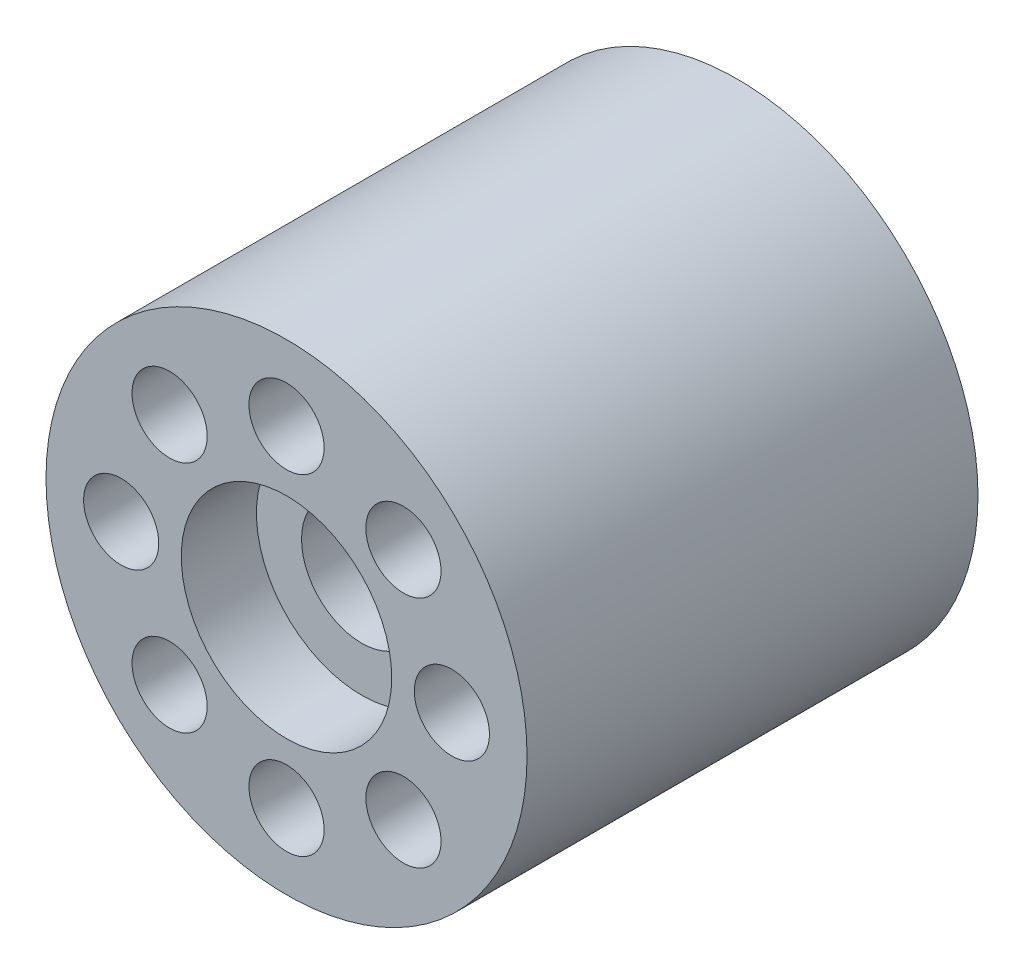
ISO-10303-21;
HEADER;
FILE_DESCRIPTION(('STEP AP214'),'2;1');
FILE_NAME('part.step','',(''),(''),'','','');
FILE_SCHEMA(('AUTOMOTIVE_DESIGN { 1 0 10303 214 1 1 1 1 }'));
ENDSEC;
DATA;
#1=APPLICATION_CONTEXT('core data for automotive mechanical design processes');
#2=APPLICATION_PROTOCOL_DEFINITION('international standard','automotive_design',2000,#1);
#3=PRODUCT_CONTEXT('',#1,'mechanical');
#4=PRODUCT('Part','Part','',(#3));
#5=PRODUCT_RELATED_PRODUCT_CATEGORY('part','',(#4));
#6=PRODUCT_DEFINITION_FORMATION('','',#4);
#7=PRODUCT_DEFINITION_CONTEXT('part definition',#1,'design');
#8=PRODUCT_DEFINITION('design','',#6,#7);
#9=PRODUCT_DEFINITION_SHAPE('','',#8);
#10=(LENGTH_UNIT() NAMED_UNIT(*) SI_UNIT(.MILLI.,.METRE.));
#11=(NAMED_UNIT(*) PLANE_ANGLE_UNIT() SI_UNIT($,.RADIAN.));
#12=(NAMED_UNIT(*) SI_UNIT($,.STERADIAN.) SOLID_ANGLE_UNIT());
#13=UNCERTAINTY_MEASURE_WITH_UNIT(LENGTH_MEASURE(1.E-05),#10,'distance_accuracy_value','');
#14=(GEOMETRIC_REPRESENTATION_CONTEXT(3) GLOBAL_UNCERTAINTY_ASSIGNED_CONTEXT((#13)) GLOBAL_UNIT_ASSIGNED_CONTEXT((#10,
#11,#12)) REPRESENTATION_CONTEXT('',''));
#15=CARTESIAN_POINT('',(0.,0.,0.));
#16=DIRECTION('',(0.,0.,1.));
#17=DIRECTION('',(1.,0.,0.));
#18=AXIS2_PLACEMENT_3D('',#15,#16,#17);
#19=CARTESIAN_POINT('',(0.,0.,0.));
#20=DIRECTION('',(0.,0.,1.));
#21=DIRECTION('',(1.,0.,0.));
#22=AXIS2_PLACEMENT_3D('',#19,#20,#21);
#23=PLANE('',#22);
#24=CARTESIAN_POINT('',(0.,0.,0.));
#25=DIRECTION('',(0.,0.,-1.));
#26=DIRECTION('',(-1.,0.,0.));
#27=AXIS2_PLACEMENT_3D('',#24,#25,#26);
#28=CIRCLE('',#27,6.);
#29=CARTESIAN_POINT('',(-6.,0.,0.));
#30=VERTEX_POINT('',#29);
#31=EDGE_CURVE('E159',#30,#30,#28,.T.);
#32=ORIENTED_EDGE('',*,*,#31,.F.);
#33=EDGE_LOOP('',(#32));
#34=FACE_BOUND('',#33,.T.);
#35=CARTESIAN_POINT('',(0.,0.,0.));
#36=DIRECTION('',(0.,0.,1.));
#37=DIRECTION('',(1.,0.,0.));
#38=AXIS2_PLACEMENT_3D('',#35,#36,#37);
#39=CIRCLE('',#38,13.5);
#40=CARTESIAN_POINT('',(13.5,1.41404994223147E-13,0.));
#41=VERTEX_POINT('',#40);
#42=CARTESIAN_POINT('',(9.54594154601828,9.54594154601851,0.));
#43=VERTEX_POINT('',#42);
#44=EDGE_CURVE('E179',#41,#43,#39,.T.);
#45=ORIENTED_EDGE('',*,*,#44,.F.);
#46=CARTESIAN_POINT('',(11.,1.15218884181823E-13,0.));
#47=DIRECTION('',(0.,0.,1.));
#48=DIRECTION('',(0.,-1.,0.));
#49=AXIS2_PLACEMENT_3D('',#46,#47,#48);
#50=CIRCLE('',#49,2.5);
#51=EDGE_CURVE('E82',#41,#41,#50,.T.);
#52=ORIENTED_EDGE('',*,*,#51,.T.);
#53=CARTESIAN_POINT('',(9.54594154601848,-9.54594154601831,0.));
#54=VERTEX_POINT('',#53);
#55=EDGE_CURVE('E183',#54,#41,#39,.T.);
#56=ORIENTED_EDGE('',*,*,#55,.F.);
#57=CARTESIAN_POINT('',(7.77817459305209,-7.77817459305195,0.));
#58=DIRECTION('',(0.,0.,1.));
#59=DIRECTION('',(-0.707106781186541,-0.707106781186554,0.));
#60=AXIS2_PLACEMENT_3D('',#57,#58,#59);
#61=CIRCLE('',#60,2.5);
#62=EDGE_CURVE('E86',#54,#54,#61,.T.);
#63=ORIENTED_EDGE('',*,*,#62,.T.);
#64=CARTESIAN_POINT('',(0.,-13.5,0.));
#65=VERTEX_POINT('',#64);
#66=EDGE_CURVE('E189',#65,#54,#39,.T.);
#67=ORIENTED_EDGE('',*,*,#66,.F.);
#68=CARTESIAN_POINT('',(0.,-11.,0.));
#69=DIRECTION('',(0.,0.,1.));
#70=DIRECTION('',(-1.,0.,0.));
#71=AXIS2_PLACEMENT_3D('',#68,#69,#70);
#72=CIRCLE('',#71,2.5);
#73=EDGE_CURVE('E92',#65,#65,#72,.T.);
#74=ORIENTED_EDGE('',*,*,#73,.T.);
#75=CARTESIAN_POINT('',(-9.54594154601834,-9.54594154601844,0.));
#76=VERTEX_POINT('',#75);
#77=EDGE_CURVE('E192',#76,#65,#39,.T.);
#78=ORIENTED_EDGE('',*,*,#77,.F.);
#79=CARTESIAN_POINT('',(-7.77817459305198,-7.77817459305206,0.));
#80=DIRECTION('',(0.,0.,1.));
#81=DIRECTION('',(-0.707106781186551,0.707106781186544,0.));
#82=AXIS2_PLACEMENT_3D('',#79,#80,#81);
#83=CIRCLE('',#82,2.5);
#84=EDGE_CURVE('E105',#76,#76,#83,.T.);
#85=ORIENTED_EDGE('',*,*,#84,.T.);
#86=CARTESIAN_POINT('',(-13.5,0.,0.));
#87=VERTEX_POINT('',#86);
#88=EDGE_CURVE('E195',#87,#76,#39,.T.);
#89=ORIENTED_EDGE('',*,*,#88,.F.);
#90=CARTESIAN_POINT('',(-11.,0.,0.));
#91=DIRECTION('',(0.,0.,1.));
#92=DIRECTION('',(0.,1.,0.));
#93=AXIS2_PLACEMENT_3D('',#90,#91,#92);
#94=CIRCLE('',#93,2.5);
#95=EDGE_CURVE('E101',#87,#87,#94,.T.);
#96=ORIENTED_EDGE('',*,*,#95,.T.);
#97=CARTESIAN_POINT('',(-9.54594154601841,9.54594154601837,0.));
#98=VERTEX_POINT('',#97);
#99=EDGE_CURVE('E62',#98,#87,#39,.T.);
#100=ORIENTED_EDGE('',*,*,#99,.F.);
#101=CARTESIAN_POINT('',(-7.77817459305204,7.77817459305201,0.));
#102=DIRECTION('',(0.,0.,1.));
#103=DIRECTION('',(0.707106781186546,0.707106781186549,0.));
#104=AXIS2_PLACEMENT_3D('',#101,#102,#103);
#105=CIRCLE('',#104,2.5);
#106=EDGE_CURVE('E104',#98,#98,#105,.T.);
#107=ORIENTED_EDGE('',*,*,#106,.T.);
#108=CARTESIAN_POINT('',(0.,13.5,0.));
#109=VERTEX_POINT('',#108);
#110=EDGE_CURVE('E57',#109,#98,#39,.T.);
#111=ORIENTED_EDGE('',*,*,#110,.F.);
#112=CARTESIAN_POINT('',(0.,11.,0.));
#113=DIRECTION('',(0.,0.,1.));
#114=DIRECTION('',(1.,0.,0.));
#115=AXIS2_PLACEMENT_3D('',#112,#113,#114);
#116=CIRCLE('',#115,2.5);
#117=EDGE_CURVE('E142',#109,#109,#116,.T.);
#118=ORIENTED_EDGE('',*,*,#117,.T.);
#119=EDGE_CURVE('E182',#43,#109,#39,.T.);
#120=ORIENTED_EDGE('',*,*,#119,.F.);
#121=CARTESIAN_POINT('',(7.77817459305193,7.77817459305212,0.));
#122=DIRECTION('',(0.,0.,1.));
#123=DIRECTION('',(0.707106781186556,-0.707106781186539,0.));
#124=AXIS2_PLACEMENT_3D('',#121,#122,#123);
#125=CIRCLE('',#124,2.5);
#126=EDGE_CURVE('E87',#43,#43,#125,.T.);
#127=ORIENTED_EDGE('',*,*,#126,.T.);
#128=EDGE_LOOP('',(#45,#52,#56,#63,#67,#74,#78,#85,#89,#96,#100,#107,#111,#118,#120,#127));
#129=FACE_BOUND('',#128,.T.);
#130=ADVANCED_FACE('F39',(#34,#129),#23,.F.);
#131=CARTESIAN_POINT('',(0.,0.,10.));
#132=DIRECTION('',(0.,0.,-1.));
#133=DIRECTION('',(-1.,0.,0.));
#134=AXIS2_PLACEMENT_3D('',#131,#132,#133);
#135=CYLINDRICAL_SURFACE('',#134,4.);
#136=CARTESIAN_POINT('',(0.,0.,5.));
#137=DIRECTION('',(0.,0.,1.));
#138=DIRECTION('',(1.,0.,0.));
#139=AXIS2_PLACEMENT_3D('',#136,#137,#138);
#140=CIRCLE('',#139,4.);
#141=CARTESIAN_POINT('',(4.,0.,5.));
#142=VERTEX_POINT('',#141);
#143=EDGE_CURVE('E95',#142,#142,#140,.T.);
#144=ORIENTED_EDGE('',*,*,#143,.T.);
#145=EDGE_LOOP('',(#144));
#146=FACE_BOUND('',#145,.T.);
#147=CARTESIAN_POINT('',(0.,0.,0.999999999999999));
#148=DIRECTION('',(0.,0.,-1.));
#149=DIRECTION('',(-1.,0.,0.));
#150=AXIS2_PLACEMENT_3D('',#147,#148,#149);
#151=CIRCLE('',#150,4.);
#152=CARTESIAN_POINT('',(-4.,0.,0.999999999999999));
#153=VERTEX_POINT('',#152);
#154=EDGE_CURVE('E43',#153,#153,#151,.T.);
#155=ORIENTED_EDGE('',*,*,#154,.T.);
#156=EDGE_LOOP('',(#155));
#157=FACE_BOUND('',#156,.T.);
#158=ADVANCED_FACE('F221',(#146,#157),#135,.F.);
#159=CARTESIAN_POINT('',(0.,0.,10.));
#160=DIRECTION('',(0.,0.,1.));
#161=DIRECTION('',(1.,0.,0.));
#162=AXIS2_PLACEMENT_3D('',#159,#160,#161);
#163=PLANE('',#162);
#164=CARTESIAN_POINT('',(0.,0.,10.));
#165=DIRECTION('',(0.,0.,1.));
#166=DIRECTION('',(1.,0.,0.));
#167=AXIS2_PLACEMENT_3D('',#164,#165,#166);
#168=CIRCLE('',#167,7.);
#169=CARTESIAN_POINT('',(7.,0.,10.));
#170=VERTEX_POINT('',#169);
#171=EDGE_CURVE('E98',#170,#170,#168,.T.);
#172=ORIENTED_EDGE('',*,*,#171,.F.);
#173=EDGE_LOOP('',(#172));
#174=FACE_BOUND('',#173,.T.);
#175=CARTESIAN_POINT('',(-11.,0.,10.));
#176=DIRECTION('',(0.,0.,1.));
#177=DIRECTION('',(1.,0.,0.));
#178=AXIS2_PLACEMENT_3D('',#175,#176,#177);
#179=CIRCLE('',#178,2.5);
#180=CARTESIAN_POINT('',(-8.5,0.,10.));
#181=VERTEX_POINT('',#180);
#182=EDGE_CURVE('E138',#181,#181,#179,.F.);
#183=ORIENTED_EDGE('',*,*,#182,.T.);
#184=EDGE_LOOP('',(#183));
#185=FACE_BOUND('',#184,.T.);
#186=CARTESIAN_POINT('',(-7.77817459305198,-7.77817459305206,10.));
#187=DIRECTION('',(0.,0.,1.));
#188=DIRECTION('',(1.,0.,0.));
#189=AXIS2_PLACEMENT_3D('',#186,#187,#188);
#190=CIRCLE('',#189,2.5);
#191=CARTESIAN_POINT('',(-5.27817459305198,-7.77817459305206,10.));
#192=VERTEX_POINT('',#191);
#193=EDGE_CURVE('E134',#192,#192,#190,.F.);
#194=ORIENTED_EDGE('',*,*,#193,.T.);
#195=EDGE_LOOP('',(#194));
#196=FACE_BOUND('',#195,.T.);
#197=CARTESIAN_POINT('',(0.,-11.,10.));
#198=DIRECTION('',(0.,0.,1.));
#199=DIRECTION('',(1.,0.,0.));
#200=AXIS2_PLACEMENT_3D('',#197,#198,#199);
#201=CIRCLE('',#200,2.5);
#202=CARTESIAN_POINT('',(2.5,-11.,10.));
#203=VERTEX_POINT('',#202);
#204=EDGE_CURVE('E130',#203,#203,#201,.F.);
#205=ORIENTED_EDGE('',*,*,#204,.T.);
#206=EDGE_LOOP('',(#205));
#207=FACE_BOUND('',#206,.T.);
#208=CARTESIAN_POINT('',(7.77817459305209,-7.77817459305195,10.));
#209=DIRECTION('',(0.,0.,1.));
#210=DIRECTION('',(1.,0.,0.));
#211=AXIS2_PLACEMENT_3D('',#208,#209,#210);
#212=CIRCLE('',#211,2.5);
#213=CARTESIAN_POINT('',(10.2781745930521,-7.77817459305195,10.));
#214=VERTEX_POINT('',#213);
#215=EDGE_CURVE('E126',#214,#214,#212,.F.);
#216=ORIENTED_EDGE('',*,*,#215,.T.);
#217=EDGE_LOOP('',(#216));
#218=FACE_BOUND('',#217,.T.);
#219=CARTESIAN_POINT('',(11.,1.15218884181823E-13,10.));
#220=DIRECTION('',(0.,0.,1.));
#221=DIRECTION('',(1.,0.,0.));
#222=AXIS2_PLACEMENT_3D('',#219,#220,#221);
#223=CIRCLE('',#222,2.5);
#224=CARTESIAN_POINT('',(13.5,1.15218884181823E-13,10.));
#225=VERTEX_POINT('',#224);
#226=EDGE_CURVE('E122',#225,#225,#223,.F.);
#227=ORIENTED_EDGE('',*,*,#226,.T.);
#228=EDGE_LOOP('',(#227));
#229=FACE_BOUND('',#228,.T.);
#230=CARTESIAN_POINT('',(7.77817459305193,7.77817459305212,10.));
#231=DIRECTION('',(0.,0.,1.));
#232=DIRECTION('',(1.,0.,0.));
#233=AXIS2_PLACEMENT_3D('',#230,#231,#232);
#234=CIRCLE('',#233,2.5);
#235=CARTESIAN_POINT('',(10.2781745930519,7.77817459305212,10.));
#236=VERTEX_POINT('',#235);
#237=EDGE_CURVE('E118',#236,#236,#234,.F.);
#238=ORIENTED_EDGE('',*,*,#237,.T.);
#239=EDGE_LOOP('',(#238));
#240=FACE_BOUND('',#239,.T.);
#241=CARTESIAN_POINT('',(-7.77817459305204,7.77817459305201,10.));
#242=DIRECTION('',(0.,0.,1.));
#243=DIRECTION('',(1.,0.,0.));
#244=AXIS2_PLACEMENT_3D('',#241,#242,#243);
#245=CIRCLE('',#244,2.5);
#246=CARTESIAN_POINT('',(-5.27817459305203,7.77817459305201,10.));
#247=VERTEX_POINT('',#246);
#248=EDGE_CURVE('E114',#247,#247,#245,.F.);
#249=ORIENTED_EDGE('',*,*,#248,.T.);
#250=EDGE_LOOP('',(#249));
#251=FACE_BOUND('',#250,.T.);
#252=CARTESIAN_POINT('',(0.,11.,10.));
#253=DIRECTION('',(0.,0.,1.));
#254=DIRECTION('',(1.,0.,0.));
#255=AXIS2_PLACEMENT_3D('',#252,#253,#254);
#256=CIRCLE('',#255,2.5);
#257=CARTESIAN_POINT('',(2.5,11.,10.));
#258=VERTEX_POINT('',#257);
#259=EDGE_CURVE('E49',#258,#258,#256,.F.);
#260=ORIENTED_EDGE('',*,*,#259,.T.);
#261=EDGE_LOOP('',(#260));
#262=FACE_BOUND('',#261,.T.);
#263=CARTESIAN_POINT('',(0.,0.,10.));
#264=DIRECTION('',(0.,0.,1.));
#265=DIRECTION('',(1.,0.,0.));
#266=AXIS2_PLACEMENT_3D('',#263,#264,#265);
#267=CIRCLE('',#266,16.);
#268=CARTESIAN_POINT('',(16.,0.,10.));
#269=VERTEX_POINT('',#268);
#270=EDGE_CURVE('E11',#269,#269,#267,.T.);
#271=ORIENTED_EDGE('',*,*,#270,.T.);
#272=EDGE_LOOP('',(#271));
#273=FACE_BOUND('',#272,.T.);
#274=ADVANCED_FACE('F216',(#174,#185,#196,#207,#218,#229,#240,#251,#262,#273),#163,.T.);
#275=CARTESIAN_POINT('',(0.,0.,10.));
#276=DIRECTION('',(0.,0.,-1.));
#277=DIRECTION('',(-1.,0.,0.));
#278=AXIS2_PLACEMENT_3D('',#275,#276,#277);
#279=CYLINDRICAL_SURFACE('',#278,16.);
#280=ORIENTED_EDGE('',*,*,#270,.F.);
#281=EDGE_LOOP('',(#280));
#282=FACE_BOUND('',#281,.T.);
#283=CARTESIAN_POINT('',(0.,0.,-20.));
#284=DIRECTION('',(0.,0.,-1.));
#285=DIRECTION('',(-1.,0.,0.));
#286=AXIS2_PLACEMENT_3D('',#283,#284,#285);
#287=CIRCLE('',#286,16.);
#288=CARTESIAN_POINT('',(-16.,0.,-20.));
#289=VERTEX_POINT('',#288);
#290=EDGE_CURVE('E164',#289,#289,#287,.T.);
#291=ORIENTED_EDGE('',*,*,#290,.F.);
#292=EDGE_LOOP('',(#291));
#293=FACE_BOUND('',#292,.T.);
#294=ADVANCED_FACE('F41',(#282,#293),#279,.T.);
#295=CARTESIAN_POINT('',(0.,11.,20.));
#296=DIRECTION('',(0.,0.,-1.));
#297=DIRECTION('',(-1.,0.,0.));
#298=AXIS2_PLACEMENT_3D('',#295,#296,#297);
#299=CYLINDRICAL_SURFACE('',#298,2.5);
#300=ORIENTED_EDGE('',*,*,#259,.F.);
#301=EDGE_LOOP('',(#300));
#302=FACE_BOUND('',#301,.T.);
#303=ORIENTED_EDGE('',*,*,#117,.F.);
#304=EDGE_LOOP('',(#303));
#305=FACE_BOUND('',#304,.T.);
#306=ADVANCED_FACE('F204',(#302,#305),#299,.F.);
#307=CARTESIAN_POINT('',(-7.77817459305204,7.77817459305201,20.));
#308=DIRECTION('',(0.,0.,-1.));
#309=DIRECTION('',(-1.,0.,0.));
#310=AXIS2_PLACEMENT_3D('',#307,#308,#309);
#311=CYLINDRICAL_SURFACE('',#310,2.5);
#312=ORIENTED_EDGE('',*,*,#248,.F.);
#313=EDGE_LOOP('',(#312));
#314=FACE_BOUND('',#313,.T.);
#315=ORIENTED_EDGE('',*,*,#106,.F.);
#316=EDGE_LOOP('',(#315));
#317=FACE_BOUND('',#316,.T.);
#318=ADVANCED_FACE('F206',(#314,#317),#311,.F.);
#319=CARTESIAN_POINT('',(7.77817459305193,7.77817459305212,20.));
#320=DIRECTION('',(0.,0.,-1.));
#321=DIRECTION('',(-1.,0.,0.));
#322=AXIS2_PLACEMENT_3D('',#319,#320,#321);
#323=CYLINDRICAL_SURFACE('',#322,2.5);
#324=ORIENTED_EDGE('',*,*,#237,.F.);
#325=EDGE_LOOP('',(#324));
#326=FACE_BOUND('',#325,.T.);
#327=ORIENTED_EDGE('',*,*,#126,.F.);
#328=EDGE_LOOP('',(#327));
#329=FACE_BOUND('',#328,.T.);
#330=ADVANCED_FACE('F213',(#326,#329),#323,.F.);
#331=CARTESIAN_POINT('',(11.,1.15218884181823E-13,20.));
#332=DIRECTION('',(0.,0.,-1.));
#333=DIRECTION('',(-1.,0.,0.));
#334=AXIS2_PLACEMENT_3D('',#331,#332,#333);
#335=CYLINDRICAL_SURFACE('',#334,2.5);
#336=ORIENTED_EDGE('',*,*,#226,.F.);
#337=EDGE_LOOP('',(#336));
#338=FACE_BOUND('',#337,.T.);
#339=ORIENTED_EDGE('',*,*,#51,.F.);
#340=EDGE_LOOP('',(#339));
#341=FACE_BOUND('',#340,.T.);
#342=ADVANCED_FACE('F83',(#338,#341),#335,.F.);
#343=CARTESIAN_POINT('',(7.77817459305209,-7.77817459305195,20.));
#344=DIRECTION('',(0.,0.,-1.));
#345=DIRECTION('',(-1.,0.,0.));
#346=AXIS2_PLACEMENT_3D('',#343,#344,#345);
#347=CYLINDRICAL_SURFACE('',#346,2.5);
#348=ORIENTED_EDGE('',*,*,#215,.F.);
#349=EDGE_LOOP('',(#348));
#350=FACE_BOUND('',#349,.T.);
#351=ORIENTED_EDGE('',*,*,#62,.F.);
#352=EDGE_LOOP('',(#351));
#353=FACE_BOUND('',#352,.T.);
#354=ADVANCED_FACE('F289',(#350,#353),#347,.F.);
#355=CARTESIAN_POINT('',(0.,-11.,20.));
#356=DIRECTION('',(0.,0.,-1.));
#357=DIRECTION('',(-1.,0.,0.));
#358=AXIS2_PLACEMENT_3D('',#355,#356,#357);
#359=CYLINDRICAL_SURFACE('',#358,2.5);
#360=ORIENTED_EDGE('',*,*,#204,.F.);
#361=EDGE_LOOP('',(#360));
#362=FACE_BOUND('',#361,.T.);
#363=ORIENTED_EDGE('',*,*,#73,.F.);
#364=EDGE_LOOP('',(#363));
#365=FACE_BOUND('',#364,.T.);
#366=ADVANCED_FACE('F300',(#362,#365),#359,.F.);
#367=CARTESIAN_POINT('',(-7.77817459305198,-7.77817459305206,20.));
#368=DIRECTION('',(0.,0.,-1.));
#369=DIRECTION('',(-1.,0.,0.));
#370=AXIS2_PLACEMENT_3D('',#367,#368,#369);
#371=CYLINDRICAL_SURFACE('',#370,2.5);
#372=ORIENTED_EDGE('',*,*,#193,.F.);
#373=EDGE_LOOP('',(#372));
#374=FACE_BOUND('',#373,.T.);
#375=ORIENTED_EDGE('',*,*,#84,.F.);
#376=EDGE_LOOP('',(#375));
#377=FACE_BOUND('',#376,.T.);
#378=ADVANCED_FACE('F296',(#374,#377),#371,.F.);
#379=CARTESIAN_POINT('',(-11.,0.,20.));
#380=DIRECTION('',(0.,0.,-1.));
#381=DIRECTION('',(-1.,0.,0.));
#382=AXIS2_PLACEMENT_3D('',#379,#380,#381);
#383=CYLINDRICAL_SURFACE('',#382,2.5);
#384=ORIENTED_EDGE('',*,*,#182,.F.);
#385=EDGE_LOOP('',(#384));
#386=FACE_BOUND('',#385,.T.);
#387=ORIENTED_EDGE('',*,*,#95,.F.);
#388=EDGE_LOOP('',(#387));
#389=FACE_BOUND('',#388,.T.);
#390=ADVANCED_FACE('F285',(#386,#389),#383,.F.);
#391=CARTESIAN_POINT('',(0.,0.,5.));
#392=DIRECTION('',(0.,0.,1.));
#393=DIRECTION('',(1.,0.,0.));
#394=AXIS2_PLACEMENT_3D('',#391,#392,#393);
#395=CYLINDRICAL_SURFACE('',#394,7.);
#396=CARTESIAN_POINT('',(0.,0.,5.));
#397=DIRECTION('',(0.,0.,1.));
#398=DIRECTION('',(1.,0.,0.));
#399=AXIS2_PLACEMENT_3D('',#396,#397,#398);
#400=CIRCLE('',#399,7.);
#401=CARTESIAN_POINT('',(7.,0.,5.));
#402=VERTEX_POINT('',#401);
#403=EDGE_CURVE('E149',#402,#402,#400,.T.);
#404=ORIENTED_EDGE('',*,*,#403,.F.);
#405=EDGE_LOOP('',(#404));
#406=FACE_BOUND('',#405,.T.);
#407=ORIENTED_EDGE('',*,*,#171,.T.);
#408=EDGE_LOOP('',(#407));
#409=FACE_BOUND('',#408,.T.);
#410=ADVANCED_FACE('F281',(#406,#409),#395,.F.);
#411=CARTESIAN_POINT('',(0.,0.,5.));
#412=DIRECTION('',(0.,0.,1.));
#413=DIRECTION('',(1.,0.,0.));
#414=AXIS2_PLACEMENT_3D('',#411,#412,#413);
#415=PLANE('',#414);
#416=ORIENTED_EDGE('',*,*,#143,.F.);
#417=EDGE_LOOP('',(#416));
#418=FACE_BOUND('',#417,.T.);
#419=ORIENTED_EDGE('',*,*,#403,.T.);
#420=EDGE_LOOP('',(#419));
#421=FACE_BOUND('',#420,.T.);
#422=ADVANCED_FACE('F277',(#418,#421),#415,.T.);
#423=CARTESIAN_POINT('',(0.,0.,1.));
#424=DIRECTION('',(0.,0.,-1.));
#425=DIRECTION('',(-1.,0.,0.));
#426=AXIS2_PLACEMENT_3D('',#423,#424,#425);
#427=CYLINDRICAL_SURFACE('',#426,6.);
#428=CARTESIAN_POINT('',(0.,0.,1.));
#429=DIRECTION('',(0.,0.,-1.));
#430=DIRECTION('',(-1.,0.,0.));
#431=AXIS2_PLACEMENT_3D('',#428,#429,#430);
#432=CIRCLE('',#431,6.);
#433=CARTESIAN_POINT('',(-6.,0.,1.));
#434=VERTEX_POINT('',#433);
#435=EDGE_CURVE('E163',#434,#434,#432,.T.);
#436=ORIENTED_EDGE('',*,*,#435,.F.);
#437=EDGE_LOOP('',(#436));
#438=FACE_BOUND('',#437,.T.);
#439=ORIENTED_EDGE('',*,*,#31,.T.);
#440=EDGE_LOOP('',(#439));
#441=FACE_BOUND('',#440,.T.);
#442=ADVANCED_FACE('F273',(#438,#441),#427,.F.);
#443=CARTESIAN_POINT('',(0.,0.,1.));
#444=DIRECTION('',(0.,0.,-1.));
#445=DIRECTION('',(-1.,0.,0.));
#446=AXIS2_PLACEMENT_3D('',#443,#444,#445);
#447=PLANE('',#446);
#448=ORIENTED_EDGE('',*,*,#154,.F.);
#449=EDGE_LOOP('',(#448));
#450=FACE_BOUND('',#449,.T.);
#451=ORIENTED_EDGE('',*,*,#435,.T.);
#452=EDGE_LOOP('',(#451));
#453=FACE_BOUND('',#452,.T.);
#454=ADVANCED_FACE('F257',(#450,#453),#447,.T.);
#455=CARTESIAN_POINT('',(0.,0.,-20.));
#456=DIRECTION('',(0.,0.,-1.));
#457=DIRECTION('',(-1.,0.,0.));
#458=AXIS2_PLACEMENT_3D('',#455,#456,#457);
#459=PLANE('',#458);
#460=ORIENTED_EDGE('',*,*,#290,.T.);
#461=EDGE_LOOP('',(#460));
#462=FACE_BOUND('',#461,.T.);
#463=CARTESIAN_POINT('',(0.,0.,-20.));
#464=DIRECTION('',(0.,0.,1.));
#465=DIRECTION('',(1.,0.,0.));
#466=AXIS2_PLACEMENT_3D('',#463,#464,#465);
#467=CIRCLE('',#466,6.1);
#468=CARTESIAN_POINT('',(6.1,0.,-20.));
#469=VERTEX_POINT('',#468);
#470=EDGE_CURVE('E171',#469,#469,#467,.T.);
#471=ORIENTED_EDGE('',*,*,#470,.T.);
#472=EDGE_LOOP('',(#471));
#473=FACE_BOUND('',#472,.T.);
#474=ADVANCED_FACE('F253',(#462,#473),#459,.T.);
#475=CARTESIAN_POINT('',(0.,0.,0.));
#476=DIRECTION('',(0.,0.,1.));
#477=DIRECTION('',(1.,0.,0.));
#478=AXIS2_PLACEMENT_3D('',#475,#476,#477);
#479=CYLINDRICAL_SURFACE('',#478,6.1);
#480=ORIENTED_EDGE('',*,*,#470,.F.);
#481=EDGE_LOOP('',(#480));
#482=FACE_BOUND('',#481,.T.);
#483=CARTESIAN_POINT('',(0.,0.,-9.41485338149423));
#484=DIRECTION('',(0.,0.,1.));
#485=DIRECTION('',(1.,0.,0.));
#486=AXIS2_PLACEMENT_3D('',#483,#484,#485);
#487=CIRCLE('',#486,6.1);
#488=CARTESIAN_POINT('',(6.1,0.,-9.41485338149423));
#489=VERTEX_POINT('',#488);
#490=EDGE_CURVE('E175',#489,#489,#487,.T.);
#491=ORIENTED_EDGE('',*,*,#490,.T.);
#492=EDGE_LOOP('',(#491));
#493=FACE_BOUND('',#492,.T.);
#494=ADVANCED_FACE('F256',(#482,#493),#479,.F.);
#495=CARTESIAN_POINT('',(0.,0.,0.));
#496=DIRECTION('',(0.,0.,1.));
#497=DIRECTION('',(1.,0.,0.));
#498=AXIS2_PLACEMENT_3D('',#495,#496,#497);
#499=CONICAL_SURFACE('',#498,13.5,0.666140960824039);
#500=ORIENTED_EDGE('',*,*,#490,.F.);
#501=EDGE_LOOP('',(#500));
#502=FACE_BOUND('',#501,.T.);
#503=ORIENTED_EDGE('',*,*,#44,.T.);
#504=ORIENTED_EDGE('',*,*,#119,.T.);
#505=ORIENTED_EDGE('',*,*,#110,.T.);
#506=ORIENTED_EDGE('',*,*,#99,.T.);
#507=ORIENTED_EDGE('',*,*,#88,.T.);
#508=ORIENTED_EDGE('',*,*,#77,.T.);
#509=ORIENTED_EDGE('',*,*,#66,.T.);
#510=ORIENTED_EDGE('',*,*,#55,.T.);
#511=EDGE_LOOP('',(#503,#504,#505,#506,#507,#508,#509,#510));
#512=FACE_BOUND('',#511,.T.);
#513=ADVANCED_FACE('F200',(#502,#512),#499,.F.);
#514=CLOSED_SHELL('',(#130,#158,#274,#294,#306,#318,#330,#342,#354,#366,#378,#390,#410,#422,
#442,#454,#474,#494,#513));
#515=MANIFOLD_SOLID_BREP('B2',#514);
#516=ADVANCED_BREP_SHAPE_REPRESENTATION('',(#18,#515),#14);
#517=SHAPE_DEFINITION_REPRESENTATION(#9,#516);
ENDSEC;
END-ISO-10303-21;
